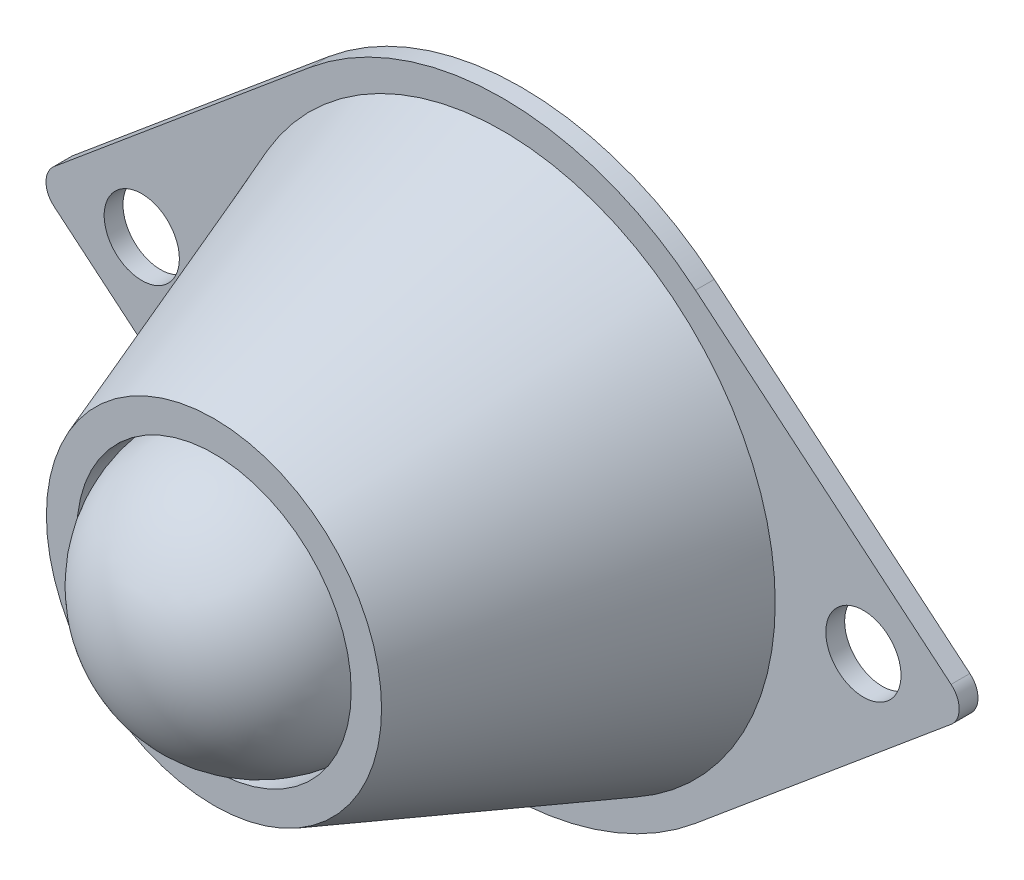
ISO-10303-21;
HEADER;
FILE_DESCRIPTION(('STEP AP214'),'2;1');
FILE_NAME('part.step','',(''),(''),'','','');
FILE_SCHEMA(('AUTOMOTIVE_DESIGN { 1 0 10303 214 1 1 1 1 }'));
ENDSEC;
DATA;
#1=APPLICATION_CONTEXT('core data for automotive mechanical design processes');
#2=APPLICATION_PROTOCOL_DEFINITION('international standard','automotive_design',2000,#1);
#3=PRODUCT_CONTEXT('',#1,'mechanical');
#4=PRODUCT('Part','Part','',(#3));
#5=PRODUCT_RELATED_PRODUCT_CATEGORY('part','',(#4));
#6=PRODUCT_DEFINITION_FORMATION('','',#4);
#7=PRODUCT_DEFINITION_CONTEXT('part definition',#1,'design');
#8=PRODUCT_DEFINITION('design','',#6,#7);
#9=PRODUCT_DEFINITION_SHAPE('','',#8);
#10=(LENGTH_UNIT() NAMED_UNIT(*) SI_UNIT(.MILLI.,.METRE.));
#11=(NAMED_UNIT(*) PLANE_ANGLE_UNIT() SI_UNIT($,.RADIAN.));
#12=(NAMED_UNIT(*) SI_UNIT($,.STERADIAN.) SOLID_ANGLE_UNIT());
#13=UNCERTAINTY_MEASURE_WITH_UNIT(LENGTH_MEASURE(1.E-05),#10,'distance_accuracy_value','');
#14=(GEOMETRIC_REPRESENTATION_CONTEXT(3) GLOBAL_UNCERTAINTY_ASSIGNED_CONTEXT((#13)) GLOBAL_UNIT_ASSIGNED_CONTEXT((#10,
#11,#12)) REPRESENTATION_CONTEXT('',''));
#15=CARTESIAN_POINT('',(0.,0.,0.));
#16=DIRECTION('',(0.,0.,1.));
#17=DIRECTION('',(1.,0.,0.));
#18=AXIS2_PLACEMENT_3D('',#15,#16,#17);
#19=CARTESIAN_POINT('',(-23.0834070118127,0.,1.));
#20=DIRECTION('',(0.,0.,1.));
#21=DIRECTION('',(1.,0.,0.));
#22=AXIS2_PLACEMENT_3D('',#19,#20,#21);
#23=PLANE('',#22);
#24=CARTESIAN_POINT('',(0.,0.,1.));
#25=DIRECTION('',(0.,0.,1.));
#26=DIRECTION('',(1.,0.,0.));
#27=AXIS2_PLACEMENT_3D('',#24,#25,#26);
#28=CIRCLE('',#27,14.5);
#29=CARTESIAN_POINT('',(14.5,0.,1.));
#30=VERTEX_POINT('',#29);
#31=EDGE_CURVE('E192',#30,#30,#28,.T.);
#32=ORIENTED_EDGE('',*,*,#31,.F.);
#33=EDGE_LOOP('',(#32));
#34=FACE_BOUND('',#33,.T.);
#35=CARTESIAN_POINT('',(-19.19,0.,1.));
#36=DIRECTION('',(0.,0.,1.));
#37=DIRECTION('',(1.,0.,0.));
#38=AXIS2_PLACEMENT_3D('',#35,#36,#37);
#39=CIRCLE('',#38,2.);
#40=CARTESIAN_POINT('',(-17.19,0.,1.));
#41=VERTEX_POINT('',#40);
#42=EDGE_CURVE('E133',#41,#41,#39,.T.);
#43=ORIENTED_EDGE('',*,*,#42,.F.);
#44=EDGE_LOOP('',(#43));
#45=FACE_BOUND('',#44,.T.);
#46=CARTESIAN_POINT('',(-23.0834070118127,0.,1.));
#47=DIRECTION('',(0.,0.,1.));
#48=DIRECTION('',(1.,0.,0.));
#49=AXIS2_PLACEMENT_3D('',#46,#47,#48);
#50=CIRCLE('',#49,1.2);
#51=CARTESIAN_POINT('',(-23.8527908376453,0.920895503598072,1.));
#52=VERTEX_POINT('',#51);
#53=CARTESIAN_POINT('',(-23.8527908376453,-0.920895503598083,1.));
#54=VERTEX_POINT('',#53);
#55=EDGE_CURVE('E144',#52,#54,#50,.T.);
#56=ORIENTED_EDGE('',*,*,#55,.T.);
#57=DIRECTION('',(0.767412919665066,-0.64115318819385,0.));
#58=VECTOR('',#57,1.);
#59=CARTESIAN_POINT('',(-23.8527908376453,-0.920895503598083,1.));
#60=LINE('',#59,#58);
#61=CARTESIAN_POINT('',(-10.2584510111016,-12.278606714641,1.));
#62=VERTEX_POINT('',#61);
#63=EDGE_CURVE('E92',#54,#62,#60,.T.);
#64=ORIENTED_EDGE('',*,*,#63,.T.);
#65=CARTESIAN_POINT('',(0.,0.,1.));
#66=DIRECTION('',(0.,0.,1.));
#67=DIRECTION('',(1.,0.,0.));
#68=AXIS2_PLACEMENT_3D('',#65,#66,#67);
#69=CIRCLE('',#68,16.);
#70=CARTESIAN_POINT('',(10.2584510111016,-12.2786067146411,1.));
#71=VERTEX_POINT('',#70);
#72=EDGE_CURVE('E159',#62,#71,#69,.T.);
#73=ORIENTED_EDGE('',*,*,#72,.T.);
#74=DIRECTION('',(0.767412919665066,0.64115318819385,0.));
#75=VECTOR('',#74,1.);
#76=CARTESIAN_POINT('',(23.8527908376453,-0.920895503598083,1.));
#77=LINE('',#76,#75);
#78=CARTESIAN_POINT('',(23.8527908376453,-0.920895503598083,1.));
#79=VERTEX_POINT('',#78);
#80=EDGE_CURVE('E172',#71,#79,#77,.T.);
#81=ORIENTED_EDGE('',*,*,#80,.T.);
#82=CARTESIAN_POINT('',(23.0834070118127,0.,1.));
#83=DIRECTION('',(0.,0.,1.));
#84=DIRECTION('',(-1.,0.,0.));
#85=AXIS2_PLACEMENT_3D('',#82,#83,#84);
#86=CIRCLE('',#85,1.2);
#87=CARTESIAN_POINT('',(23.8527908376453,0.920895503598072,1.));
#88=VERTEX_POINT('',#87);
#89=EDGE_CURVE('E111',#79,#88,#86,.T.);
#90=ORIENTED_EDGE('',*,*,#89,.T.);
#91=DIRECTION('',(-0.767412919665066,0.641153188193851,0.));
#92=VECTOR('',#91,1.);
#93=CARTESIAN_POINT('',(23.8527908376453,0.920895503598072,1.));
#94=LINE('',#93,#92);
#95=CARTESIAN_POINT('',(10.2584510111016,12.278606714641,1.));
#96=VERTEX_POINT('',#95);
#97=EDGE_CURVE('E105',#88,#96,#94,.T.);
#98=ORIENTED_EDGE('',*,*,#97,.T.);
#99=CARTESIAN_POINT('',(0.,0.,1.));
#100=DIRECTION('',(0.,0.,1.));
#101=DIRECTION('',(1.,0.,0.));
#102=AXIS2_PLACEMENT_3D('',#99,#100,#101);
#103=CIRCLE('',#102,16.);
#104=CARTESIAN_POINT('',(-10.2584510111016,12.278606714641,1.));
#105=VERTEX_POINT('',#104);
#106=EDGE_CURVE('E109',#96,#105,#103,.T.);
#107=ORIENTED_EDGE('',*,*,#106,.T.);
#108=DIRECTION('',(-0.767412919665066,-0.641153188193851,0.));
#109=VECTOR('',#108,1.);
#110=CARTESIAN_POINT('',(-23.8527908376453,0.920895503598072,1.));
#111=LINE('',#110,#109);
#112=EDGE_CURVE('E49',#105,#52,#111,.T.);
#113=ORIENTED_EDGE('',*,*,#112,.T.);
#114=EDGE_LOOP('',(#56,#64,#73,#81,#90,#98,#107,#113));
#115=FACE_BOUND('',#114,.T.);
#116=CARTESIAN_POINT('',(19.19,0.,1.));
#117=DIRECTION('',(0.,0.,1.));
#118=DIRECTION('',(-1.,0.,0.));
#119=AXIS2_PLACEMENT_3D('',#116,#117,#118);
#120=CIRCLE('',#119,2.);
#121=CARTESIAN_POINT('',(17.19,0.,1.));
#122=VERTEX_POINT('',#121);
#123=EDGE_CURVE('E181',#122,#122,#120,.T.);
#124=ORIENTED_EDGE('',*,*,#123,.F.);
#125=EDGE_LOOP('',(#124));
#126=FACE_BOUND('',#125,.T.);
#127=ADVANCED_FACE('F32',(#34,#45,#115,#126),#23,.T.);
#128=CARTESIAN_POINT('',(-23.0834070118127,0.,0.));
#129=DIRECTION('',(0.,0.,1.));
#130=DIRECTION('',(1.,0.,0.));
#131=AXIS2_PLACEMENT_3D('',#128,#129,#130);
#132=PLANE('',#131);
#133=CARTESIAN_POINT('',(-23.0834070118127,0.,0.));
#134=DIRECTION('',(0.,0.,1.));
#135=DIRECTION('',(1.,0.,0.));
#136=AXIS2_PLACEMENT_3D('',#133,#134,#135);
#137=CIRCLE('',#136,1.2);
#138=CARTESIAN_POINT('',(-23.8527908376453,0.920895503598072,0.));
#139=VERTEX_POINT('',#138);
#140=CARTESIAN_POINT('',(-23.8527908376453,-0.920895503598083,0.));
#141=VERTEX_POINT('',#140);
#142=EDGE_CURVE('E129',#139,#141,#137,.T.);
#143=ORIENTED_EDGE('',*,*,#142,.F.);
#144=DIRECTION('',(-0.767412919665066,-0.641153188193851,0.));
#145=VECTOR('',#144,1.);
#146=CARTESIAN_POINT('',(-23.8527908376453,0.920895503598072,0.));
#147=LINE('',#146,#145);
#148=CARTESIAN_POINT('',(-10.2584510111016,12.278606714641,0.));
#149=VERTEX_POINT('',#148);
#150=EDGE_CURVE('E84',#149,#139,#147,.T.);
#151=ORIENTED_EDGE('',*,*,#150,.F.);
#152=CARTESIAN_POINT('',(0.,0.,0.));
#153=DIRECTION('',(0.,0.,1.));
#154=DIRECTION('',(1.,0.,0.));
#155=AXIS2_PLACEMENT_3D('',#152,#153,#154);
#156=CIRCLE('',#155,16.);
#157=CARTESIAN_POINT('',(10.2584510111016,12.278606714641,0.));
#158=VERTEX_POINT('',#157);
#159=EDGE_CURVE('E78',#158,#149,#156,.T.);
#160=ORIENTED_EDGE('',*,*,#159,.F.);
#161=DIRECTION('',(-0.767412919665066,0.641153188193851,0.));
#162=VECTOR('',#161,1.);
#163=CARTESIAN_POINT('',(23.8527908376453,0.920895503598072,0.));
#164=LINE('',#163,#162);
#165=CARTESIAN_POINT('',(23.8527908376453,0.920895503598072,0.));
#166=VERTEX_POINT('',#165);
#167=EDGE_CURVE('E119',#166,#158,#164,.T.);
#168=ORIENTED_EDGE('',*,*,#167,.F.);
#169=CARTESIAN_POINT('',(23.0834070118127,0.,0.));
#170=DIRECTION('',(0.,0.,1.));
#171=DIRECTION('',(-1.,0.,0.));
#172=AXIS2_PLACEMENT_3D('',#169,#170,#171);
#173=CIRCLE('',#172,1.2);
#174=CARTESIAN_POINT('',(23.8527908376453,-0.920895503598083,0.));
#175=VERTEX_POINT('',#174);
#176=EDGE_CURVE('E139',#175,#166,#173,.T.);
#177=ORIENTED_EDGE('',*,*,#176,.F.);
#178=DIRECTION('',(0.767412919665066,0.64115318819385,0.));
#179=VECTOR('',#178,1.);
#180=CARTESIAN_POINT('',(23.8527908376453,-0.920895503598083,0.));
#181=LINE('',#180,#179);
#182=CARTESIAN_POINT('',(10.2584510111016,-12.2786067146411,0.));
#183=VERTEX_POINT('',#182);
#184=EDGE_CURVE('E137',#183,#175,#181,.T.);
#185=ORIENTED_EDGE('',*,*,#184,.F.);
#186=CARTESIAN_POINT('',(0.,0.,0.));
#187=DIRECTION('',(0.,0.,1.));
#188=DIRECTION('',(1.,0.,0.));
#189=AXIS2_PLACEMENT_3D('',#186,#187,#188);
#190=CIRCLE('',#189,16.);
#191=CARTESIAN_POINT('',(-10.2584510111016,-12.278606714641,0.));
#192=VERTEX_POINT('',#191);
#193=EDGE_CURVE('E135',#192,#183,#190,.T.);
#194=ORIENTED_EDGE('',*,*,#193,.F.);
#195=DIRECTION('',(0.767412919665066,-0.64115318819385,0.));
#196=VECTOR('',#195,1.);
#197=CARTESIAN_POINT('',(-23.8527908376453,-0.920895503598083,0.));
#198=LINE('',#197,#196);
#199=EDGE_CURVE('E132',#141,#192,#198,.T.);
#200=ORIENTED_EDGE('',*,*,#199,.F.);
#201=EDGE_LOOP('',(#143,#151,#160,#168,#177,#185,#194,#200));
#202=FACE_BOUND('',#201,.T.);
#203=CARTESIAN_POINT('',(-19.19,0.,0.));
#204=DIRECTION('',(0.,0.,1.));
#205=DIRECTION('',(1.,0.,0.));
#206=AXIS2_PLACEMENT_3D('',#203,#204,#205);
#207=CIRCLE('',#206,2.);
#208=CARTESIAN_POINT('',(-17.19,0.,0.));
#209=VERTEX_POINT('',#208);
#210=EDGE_CURVE('E178',#209,#209,#207,.T.);
#211=ORIENTED_EDGE('',*,*,#210,.T.);
#212=EDGE_LOOP('',(#211));
#213=FACE_BOUND('',#212,.T.);
#214=CARTESIAN_POINT('',(19.19,0.,0.));
#215=DIRECTION('',(0.,0.,1.));
#216=DIRECTION('',(-1.,0.,0.));
#217=AXIS2_PLACEMENT_3D('',#214,#215,#216);
#218=CIRCLE('',#217,2.);
#219=CARTESIAN_POINT('',(17.19,0.,0.));
#220=VERTEX_POINT('',#219);
#221=EDGE_CURVE('E184',#220,#220,#218,.T.);
#222=ORIENTED_EDGE('',*,*,#221,.T.);
#223=EDGE_LOOP('',(#222));
#224=FACE_BOUND('',#223,.T.);
#225=ADVANCED_FACE('F163',(#202,#213,#224),#132,.F.);
#226=CARTESIAN_POINT('',(-23.0834070118127,0.,1.));
#227=DIRECTION('',(0.,0.,-1.));
#228=DIRECTION('',(-1.,0.,0.));
#229=AXIS2_PLACEMENT_3D('',#226,#227,#228);
#230=CYLINDRICAL_SURFACE('',#229,1.2);
#231=ORIENTED_EDGE('',*,*,#142,.T.);
#232=DIRECTION('',(0.,0.,-1.));
#233=VECTOR('',#232,1.);
#234=CARTESIAN_POINT('',(-23.8527908376453,-0.920895503598083,1.));
#235=LINE('',#234,#233);
#236=EDGE_CURVE('E11',#54,#141,#235,.T.);
#237=ORIENTED_EDGE('',*,*,#236,.F.);
#238=ORIENTED_EDGE('',*,*,#55,.F.);
#239=DIRECTION('',(0.,0.,-1.));
#240=VECTOR('',#239,1.);
#241=CARTESIAN_POINT('',(-23.8527908376453,0.920895503598072,1.));
#242=LINE('',#241,#240);
#243=EDGE_CURVE('E125',#52,#139,#242,.T.);
#244=ORIENTED_EDGE('',*,*,#243,.T.);
#245=EDGE_LOOP('',(#231,#237,#238,#244));
#246=FACE_BOUND('',#245,.T.);
#247=ADVANCED_FACE('F34',(#246),#230,.T.);
#248=CARTESIAN_POINT('',(-23.8527908376453,-0.920895503598083,1.));
#249=DIRECTION('',(0.64115318819385,0.767412919665066,0.));
#250=DIRECTION('',(-0.767412919665066,0.64115318819385,0.));
#251=AXIS2_PLACEMENT_3D('',#248,#249,#250);
#252=PLANE('',#251);
#253=ORIENTED_EDGE('',*,*,#199,.T.);
#254=DIRECTION('',(0.,0.,-1.));
#255=VECTOR('',#254,1.);
#256=CARTESIAN_POINT('',(-10.2584510111016,-12.278606714641,1.));
#257=LINE('',#256,#255);
#258=EDGE_CURVE('E41',#62,#192,#257,.T.);
#259=ORIENTED_EDGE('',*,*,#258,.F.);
#260=ORIENTED_EDGE('',*,*,#63,.F.);
#261=ORIENTED_EDGE('',*,*,#236,.T.);
#262=EDGE_LOOP('',(#253,#259,#260,#261));
#263=FACE_BOUND('',#262,.T.);
#264=ADVANCED_FACE('F256',(#263),#252,.F.);
#265=CARTESIAN_POINT('',(0.,0.,1.));
#266=DIRECTION('',(0.,0.,-1.));
#267=DIRECTION('',(-1.,0.,0.));
#268=AXIS2_PLACEMENT_3D('',#265,#266,#267);
#269=CYLINDRICAL_SURFACE('',#268,16.);
#270=ORIENTED_EDGE('',*,*,#193,.T.);
#271=DIRECTION('',(0.,0.,-1.));
#272=VECTOR('',#271,1.);
#273=CARTESIAN_POINT('',(10.2584510111016,-12.2786067146411,1.));
#274=LINE('',#273,#272);
#275=EDGE_CURVE('E151',#71,#183,#274,.T.);
#276=ORIENTED_EDGE('',*,*,#275,.F.);
#277=ORIENTED_EDGE('',*,*,#72,.F.);
#278=ORIENTED_EDGE('',*,*,#258,.T.);
#279=EDGE_LOOP('',(#270,#276,#277,#278));
#280=FACE_BOUND('',#279,.T.);
#281=ADVANCED_FACE('F157',(#280),#269,.T.);
#282=CARTESIAN_POINT('',(23.8527908376453,-0.920895503598083,1.));
#283=DIRECTION('',(-0.64115318819385,0.767412919665066,0.));
#284=DIRECTION('',(-0.767412919665066,-0.64115318819385,0.));
#285=AXIS2_PLACEMENT_3D('',#282,#283,#284);
#286=PLANE('',#285);
#287=ORIENTED_EDGE('',*,*,#184,.T.);
#288=DIRECTION('',(0.,0.,-1.));
#289=VECTOR('',#288,1.);
#290=CARTESIAN_POINT('',(23.8527908376453,-0.920895503598083,1.));
#291=LINE('',#290,#289);
#292=EDGE_CURVE('E148',#79,#175,#291,.T.);
#293=ORIENTED_EDGE('',*,*,#292,.F.);
#294=ORIENTED_EDGE('',*,*,#80,.F.);
#295=ORIENTED_EDGE('',*,*,#275,.T.);
#296=EDGE_LOOP('',(#287,#293,#294,#295));
#297=FACE_BOUND('',#296,.T.);
#298=ADVANCED_FACE('F168',(#297),#286,.F.);
#299=CARTESIAN_POINT('',(23.0834070118127,0.,1.));
#300=DIRECTION('',(0.,0.,-1.));
#301=DIRECTION('',(-1.,0.,0.));
#302=AXIS2_PLACEMENT_3D('',#299,#300,#301);
#303=CYLINDRICAL_SURFACE('',#302,1.2);
#304=ORIENTED_EDGE('',*,*,#176,.T.);
#305=DIRECTION('',(0.,0.,-1.));
#306=VECTOR('',#305,1.);
#307=CARTESIAN_POINT('',(23.8527908376453,0.920895503598072,1.));
#308=LINE('',#307,#306);
#309=EDGE_CURVE('E120',#88,#166,#308,.T.);
#310=ORIENTED_EDGE('',*,*,#309,.F.);
#311=ORIENTED_EDGE('',*,*,#89,.F.);
#312=ORIENTED_EDGE('',*,*,#292,.T.);
#313=EDGE_LOOP('',(#304,#310,#311,#312));
#314=FACE_BOUND('',#313,.T.);
#315=ADVANCED_FACE('F171',(#314),#303,.T.);
#316=CARTESIAN_POINT('',(23.8527908376453,0.920895503598072,1.));
#317=DIRECTION('',(-0.641153188193851,-0.767412919665066,0.));
#318=DIRECTION('',(0.767412919665066,-0.641153188193851,0.));
#319=AXIS2_PLACEMENT_3D('',#316,#317,#318);
#320=PLANE('',#319);
#321=ORIENTED_EDGE('',*,*,#167,.T.);
#322=DIRECTION('',(0.,0.,-1.));
#323=VECTOR('',#322,1.);
#324=CARTESIAN_POINT('',(10.2584510111016,12.278606714641,1.));
#325=LINE('',#324,#323);
#326=EDGE_CURVE('E116',#96,#158,#325,.T.);
#327=ORIENTED_EDGE('',*,*,#326,.F.);
#328=ORIENTED_EDGE('',*,*,#97,.F.);
#329=ORIENTED_EDGE('',*,*,#309,.T.);
#330=EDGE_LOOP('',(#321,#327,#328,#329));
#331=FACE_BOUND('',#330,.T.);
#332=ADVANCED_FACE('F117',(#331),#320,.F.);
#333=CARTESIAN_POINT('',(0.,0.,1.));
#334=DIRECTION('',(0.,0.,-1.));
#335=DIRECTION('',(-1.,0.,0.));
#336=AXIS2_PLACEMENT_3D('',#333,#334,#335);
#337=CYLINDRICAL_SURFACE('',#336,16.);
#338=ORIENTED_EDGE('',*,*,#159,.T.);
#339=DIRECTION('',(0.,0.,-1.));
#340=VECTOR('',#339,1.);
#341=CARTESIAN_POINT('',(-10.2584510111016,12.278606714641,1.));
#342=LINE('',#341,#340);
#343=EDGE_CURVE('E121',#105,#149,#342,.T.);
#344=ORIENTED_EDGE('',*,*,#343,.F.);
#345=ORIENTED_EDGE('',*,*,#106,.F.);
#346=ORIENTED_EDGE('',*,*,#326,.T.);
#347=EDGE_LOOP('',(#338,#344,#345,#346));
#348=FACE_BOUND('',#347,.T.);
#349=ADVANCED_FACE('F123',(#348),#337,.T.);
#350=CARTESIAN_POINT('',(-23.8527908376453,0.920895503598072,1.));
#351=DIRECTION('',(0.641153188193851,-0.767412919665066,0.));
#352=DIRECTION('',(0.767412919665066,0.641153188193851,0.));
#353=AXIS2_PLACEMENT_3D('',#350,#351,#352);
#354=PLANE('',#353);
#355=ORIENTED_EDGE('',*,*,#150,.T.);
#356=ORIENTED_EDGE('',*,*,#243,.F.);
#357=ORIENTED_EDGE('',*,*,#112,.F.);
#358=ORIENTED_EDGE('',*,*,#343,.T.);
#359=EDGE_LOOP('',(#355,#356,#357,#358));
#360=FACE_BOUND('',#359,.T.);
#361=ADVANCED_FACE('F231',(#360),#354,.F.);
#362=CARTESIAN_POINT('',(-19.19,0.,1.));
#363=DIRECTION('',(0.,0.,-1.));
#364=DIRECTION('',(-1.,0.,0.));
#365=AXIS2_PLACEMENT_3D('',#362,#363,#364);
#366=CYLINDRICAL_SURFACE('',#365,2.);
#367=ORIENTED_EDGE('',*,*,#42,.T.);
#368=EDGE_LOOP('',(#367));
#369=FACE_BOUND('',#368,.T.);
#370=ORIENTED_EDGE('',*,*,#210,.F.);
#371=EDGE_LOOP('',(#370));
#372=FACE_BOUND('',#371,.T.);
#373=ADVANCED_FACE('F228',(#369,#372),#366,.F.);
#374=CARTESIAN_POINT('',(19.19,0.,1.));
#375=DIRECTION('',(0.,0.,-1.));
#376=DIRECTION('',(-1.,0.,0.));
#377=AXIS2_PLACEMENT_3D('',#374,#375,#376);
#378=CYLINDRICAL_SURFACE('',#377,2.);
#379=ORIENTED_EDGE('',*,*,#123,.T.);
#380=EDGE_LOOP('',(#379));
#381=FACE_BOUND('',#380,.T.);
#382=ORIENTED_EDGE('',*,*,#221,.F.);
#383=EDGE_LOOP('',(#382));
#384=FACE_BOUND('',#383,.T.);
#385=ADVANCED_FACE('F219',(#381,#384),#378,.F.);
#386=CARTESIAN_POINT('',(0.,0.,1.));
#387=DIRECTION('',(0.,0.,-1.));
#388=DIRECTION('',(1.,0.,0.));
#389=AXIS2_PLACEMENT_3D('',#386,#387,#388);
#390=CONICAL_SURFACE('',#389,14.5,0.349065850398867);
#391=CARTESIAN_POINT('',(0.,0.,16.35));
#392=DIRECTION('',(0.,0.,1.));
#393=DIRECTION('',(1.,0.,0.));
#394=AXIS2_PLACEMENT_3D('',#391,#392,#393);
#395=CIRCLE('',#394,8.91305690401378);
#396=CARTESIAN_POINT('',(8.91305690401378,0.,16.35));
#397=VERTEX_POINT('',#396);
#398=EDGE_CURVE('E187',#397,#397,#395,.T.);
#399=ORIENTED_EDGE('',*,*,#398,.F.);
#400=EDGE_LOOP('',(#399));
#401=FACE_BOUND('',#400,.T.);
#402=ORIENTED_EDGE('',*,*,#31,.T.);
#403=EDGE_LOOP('',(#402));
#404=FACE_BOUND('',#403,.T.);
#405=ADVANCED_FACE('F213',(#401,#404),#390,.T.);
#406=CARTESIAN_POINT('',(0.,0.,16.35));
#407=DIRECTION('',(0.,0.,1.));
#408=DIRECTION('',(1.,0.,0.));
#409=AXIS2_PLACEMENT_3D('',#406,#407,#408);
#410=PLANE('',#409);
#411=CARTESIAN_POINT('',(0.,0.,16.35));
#412=DIRECTION('',(0.,0.,1.));
#413=DIRECTION('',(1.,0.,0.));
#414=AXIS2_PLACEMENT_3D('',#411,#412,#413);
#415=CIRCLE('',#414,7.3);
#416=CARTESIAN_POINT('',(7.3,0.,16.35));
#417=VERTEX_POINT('',#416);
#418=EDGE_CURVE('E196',#417,#417,#415,.T.);
#419=ORIENTED_EDGE('',*,*,#418,.F.);
#420=EDGE_LOOP('',(#419));
#421=FACE_BOUND('',#420,.T.);
#422=ORIENTED_EDGE('',*,*,#398,.T.);
#423=EDGE_LOOP('',(#422));
#424=FACE_BOUND('',#423,.T.);
#425=ADVANCED_FACE('F207',(#421,#424),#410,.T.);
#426=CARTESIAN_POINT('',(0.,0.,13.95));
#427=DIRECTION('',(0.,0.,1.));
#428=DIRECTION('',(1.,0.,0.));
#429=AXIS2_PLACEMENT_3D('',#426,#427,#428);
#430=CYLINDRICAL_SURFACE('',#429,7.3);
#431=CARTESIAN_POINT('',(0.,0.,13.95));
#432=DIRECTION('',(0.,0.,1.));
#433=DIRECTION('',(1.,0.,0.));
#434=AXIS2_PLACEMENT_3D('',#431,#432,#433);
#435=CIRCLE('',#434,7.3);
#436=CARTESIAN_POINT('',(7.3,0.,13.95));
#437=VERTEX_POINT('',#436);
#438=EDGE_CURVE('E195',#437,#437,#435,.T.);
#439=ORIENTED_EDGE('',*,*,#438,.F.);
#440=EDGE_LOOP('',(#439));
#441=FACE_BOUND('',#440,.T.);
#442=ORIENTED_EDGE('',*,*,#418,.T.);
#443=EDGE_LOOP('',(#442));
#444=FACE_BOUND('',#443,.T.);
#445=ADVANCED_FACE('F204',(#441,#444),#430,.F.);
#446=CARTESIAN_POINT('',(0.,0.,13.95));
#447=DIRECTION('',(0.,-1.,0.));
#448=DIRECTION('',(-1.,0.,0.));
#449=AXIS2_PLACEMENT_3D('',#446,#447,#448);
#450=SPHERICAL_SURFACE('',#449,7.3);
#451=CARTESIAN_POINT('',(0.,0.,13.95));
#452=DIRECTION('',(0.,0.,1.));
#453=DIRECTION('',(1.,0.,0.));
#454=AXIS2_PLACEMENT_3D('',#451,#452,#453);
#455=SPHERICAL_SURFACE('',#454,7.3);
#456=ORIENTED_EDGE('',*,*,#438,.T.);
#457=EDGE_LOOP('',(#456));
#458=FACE_BOUND('',#457,.T.);
#459=ADVANCED_FACE('F202',(#458),#455,.T.);
#460=CLOSED_SHELL('',(#127,#225,#247,#264,#281,#298,#315,#332,#349,#361,#373,#385,#405,#425,
#445,#459));
#461=MANIFOLD_SOLID_BREP('B2',#460);
#462=ADVANCED_BREP_SHAPE_REPRESENTATION('',(#18,#461),#14);
#463=SHAPE_DEFINITION_REPRESENTATION(#9,#462);
ENDSEC;
END-ISO-10303-21;
